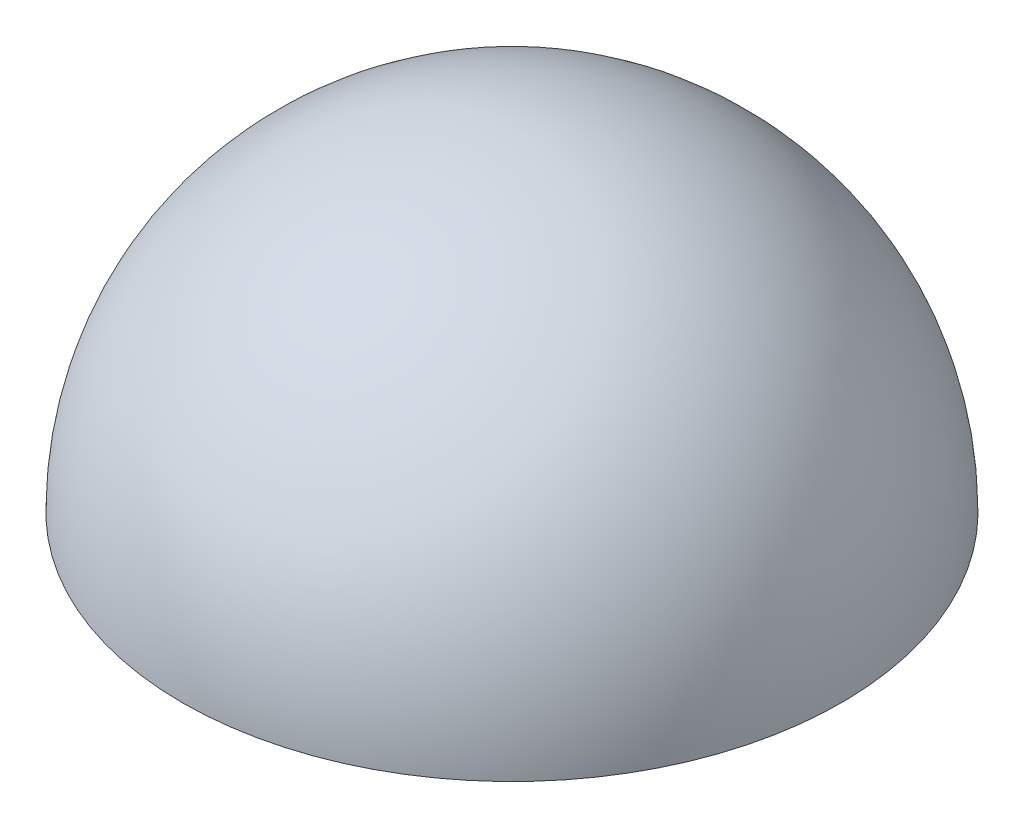
ISO-10303-21;
HEADER;
FILE_DESCRIPTION(('STEP AP214'),'2;1');
FILE_NAME('part.step','',(''),(''),'','','');
FILE_SCHEMA(('AUTOMOTIVE_DESIGN { 1 0 10303 214 1 1 1 1 }'));
ENDSEC;
DATA;
#1=APPLICATION_CONTEXT('core data for automotive mechanical design processes');
#2=APPLICATION_PROTOCOL_DEFINITION('international standard','automotive_design',2000,#1);
#3=PRODUCT_CONTEXT('',#1,'mechanical');
#4=PRODUCT('Part','Part','',(#3));
#5=PRODUCT_RELATED_PRODUCT_CATEGORY('part','',(#4));
#6=PRODUCT_DEFINITION_FORMATION('','',#4);
#7=PRODUCT_DEFINITION_CONTEXT('part definition',#1,'design');
#8=PRODUCT_DEFINITION('design','',#6,#7);
#9=PRODUCT_DEFINITION_SHAPE('','',#8);
#10=(LENGTH_UNIT() NAMED_UNIT(*) SI_UNIT(.MILLI.,.METRE.));
#11=(NAMED_UNIT(*) PLANE_ANGLE_UNIT() SI_UNIT($,.RADIAN.));
#12=(NAMED_UNIT(*) SI_UNIT($,.STERADIAN.) SOLID_ANGLE_UNIT());
#13=UNCERTAINTY_MEASURE_WITH_UNIT(LENGTH_MEASURE(1.E-05),#10,'distance_accuracy_value','');
#14=(GEOMETRIC_REPRESENTATION_CONTEXT(3) GLOBAL_UNCERTAINTY_ASSIGNED_CONTEXT((#13)) GLOBAL_UNIT_ASSIGNED_CONTEXT((#10,
#11,#12)) REPRESENTATION_CONTEXT('',''));
#15=CARTESIAN_POINT('',(0.,0.,0.));
#16=DIRECTION('',(0.,0.,1.));
#17=DIRECTION('',(1.,0.,0.));
#18=AXIS2_PLACEMENT_3D('',#15,#16,#17);
#19=CARTESIAN_POINT('',(0.,0.,0.));
#20=DIRECTION('',(0.,1.,0.));
#21=DIRECTION('',(0.,0.,1.));
#22=AXIS2_PLACEMENT_3D('',#19,#20,#21);
#23=PLANE('',#22);
#24=CARTESIAN_POINT('',(0.,0.,0.));
#25=DIRECTION('',(0.,-1.,0.));
#26=DIRECTION('',(0.,0.,-1.));
#27=AXIS2_PLACEMENT_3D('',#24,#25,#26);
#28=CIRCLE('',#27,99.);
#29=CARTESIAN_POINT('',(0.,0.,-99.));
#30=VERTEX_POINT('',#29);
#31=EDGE_CURVE('E54',#30,#30,#28,.T.);
#32=ORIENTED_EDGE('',*,*,#31,.F.);
#33=EDGE_LOOP('',(#32));
#34=FACE_BOUND('',#33,.T.);
#35=CARTESIAN_POINT('',(0.,0.,0.));
#36=DIRECTION('',(0.,1.,0.));
#37=DIRECTION('',(0.,0.,1.));
#38=AXIS2_PLACEMENT_3D('',#35,#36,#37);
#39=CIRCLE('',#38,100.);
#40=CARTESIAN_POINT('',(0.,0.,100.));
#41=VERTEX_POINT('',#40);
#42=EDGE_CURVE('E10',#41,#41,#39,.T.);
#43=ORIENTED_EDGE('',*,*,#42,.F.);
#44=EDGE_LOOP('',(#43));
#45=FACE_BOUND('',#44,.T.);
#46=ADVANCED_FACE('F41',(#34,#45),#23,.F.);
#47=CARTESIAN_POINT('',(0.,0.,0.));
#48=DIRECTION('',(0.,0.,-1.));
#49=DIRECTION('',(1.,0.,0.));
#50=AXIS2_PLACEMENT_3D('',#47,#48,#49);
#51=SPHERICAL_SURFACE('',#50,100.);
#52=CARTESIAN_POINT('',(0.,0.,0.));
#53=DIRECTION('',(0.,1.,0.));
#54=DIRECTION('',(0.,0.,1.));
#55=AXIS2_PLACEMENT_3D('',#52,#53,#54);
#56=SPHERICAL_SURFACE('',#55,100.);
#57=ORIENTED_EDGE('',*,*,#42,.T.);
#58=EDGE_LOOP('',(#57));
#59=FACE_BOUND('',#58,.T.);
#60=ADVANCED_FACE('F65',(#59),#56,.T.);
#61=CARTESIAN_POINT('',(0.,4.,0.));
#62=DIRECTION('',(0.,-1.,0.));
#63=DIRECTION('',(0.,0.,-1.));
#64=AXIS2_PLACEMENT_3D('',#61,#62,#63);
#65=CYLINDRICAL_SURFACE('',#64,99.);
#66=CARTESIAN_POINT('',(0.,4.,0.));
#67=DIRECTION('',(0.,-1.,0.));
#68=DIRECTION('',(0.,0.,-1.));
#69=AXIS2_PLACEMENT_3D('',#66,#67,#68);
#70=CIRCLE('',#69,99.);
#71=CARTESIAN_POINT('',(0.,4.,-99.));
#72=VERTEX_POINT('',#71);
#73=EDGE_CURVE('E52',#72,#72,#70,.T.);
#74=ORIENTED_EDGE('',*,*,#73,.F.);
#75=EDGE_LOOP('',(#74));
#76=FACE_BOUND('',#75,.T.);
#77=ORIENTED_EDGE('',*,*,#31,.T.);
#78=EDGE_LOOP('',(#77));
#79=FACE_BOUND('',#78,.T.);
#80=ADVANCED_FACE('F62',(#76,#79),#65,.F.);
#81=CARTESIAN_POINT('',(0.,4.,0.));
#82=DIRECTION('',(0.,-1.,0.));
#83=DIRECTION('',(0.,0.,-1.));
#84=AXIS2_PLACEMENT_3D('',#81,#82,#83);
#85=PLANE('',#84);
#86=CARTESIAN_POINT('',(0.,4.,0.));
#87=DIRECTION('',(0.,-1.,0.));
#88=DIRECTION('',(0.,0.,-1.));
#89=AXIS2_PLACEMENT_3D('',#86,#87,#88);
#90=CIRCLE('',#89,97.9183333191492);
#91=CARTESIAN_POINT('',(0.,4.,-97.9183333191492));
#92=VERTEX_POINT('',#91);
#93=EDGE_CURVE('E45',#92,#92,#90,.T.);
#94=ORIENTED_EDGE('',*,*,#93,.F.);
#95=EDGE_LOOP('',(#94));
#96=FACE_BOUND('',#95,.T.);
#97=ORIENTED_EDGE('',*,*,#73,.T.);
#98=EDGE_LOOP('',(#97));
#99=FACE_BOUND('',#98,.T.);
#100=ADVANCED_FACE('F60',(#96,#99),#85,.T.);
#101=CARTESIAN_POINT('',(0.,0.,0.));
#102=DIRECTION('',(0.,0.,-1.));
#103=DIRECTION('',(1.,0.,0.));
#104=AXIS2_PLACEMENT_3D('',#101,#102,#103);
#105=SPHERICAL_SURFACE('',#104,98.);
#106=CARTESIAN_POINT('',(0.,0.,0.));
#107=DIRECTION('',(0.,-1.,0.));
#108=DIRECTION('',(0.,0.,-1.));
#109=AXIS2_PLACEMENT_3D('',#106,#107,#108);
#110=SPHERICAL_SURFACE('',#109,98.);
#111=ORIENTED_EDGE('',*,*,#93,.T.);
#112=EDGE_LOOP('',(#111));
#113=FACE_BOUND('',#112,.T.);
#114=ADVANCED_FACE('F43',(#113),#110,.F.);
#115=CLOSED_SHELL('',(#46,#60,#80,#100,#114));
#116=MANIFOLD_SOLID_BREP('B2',#115);
#117=ADVANCED_BREP_SHAPE_REPRESENTATION('',(#18,#116),#14);
#118=SHAPE_DEFINITION_REPRESENTATION(#9,#117);
ENDSEC;
END-ISO-10303-21;
